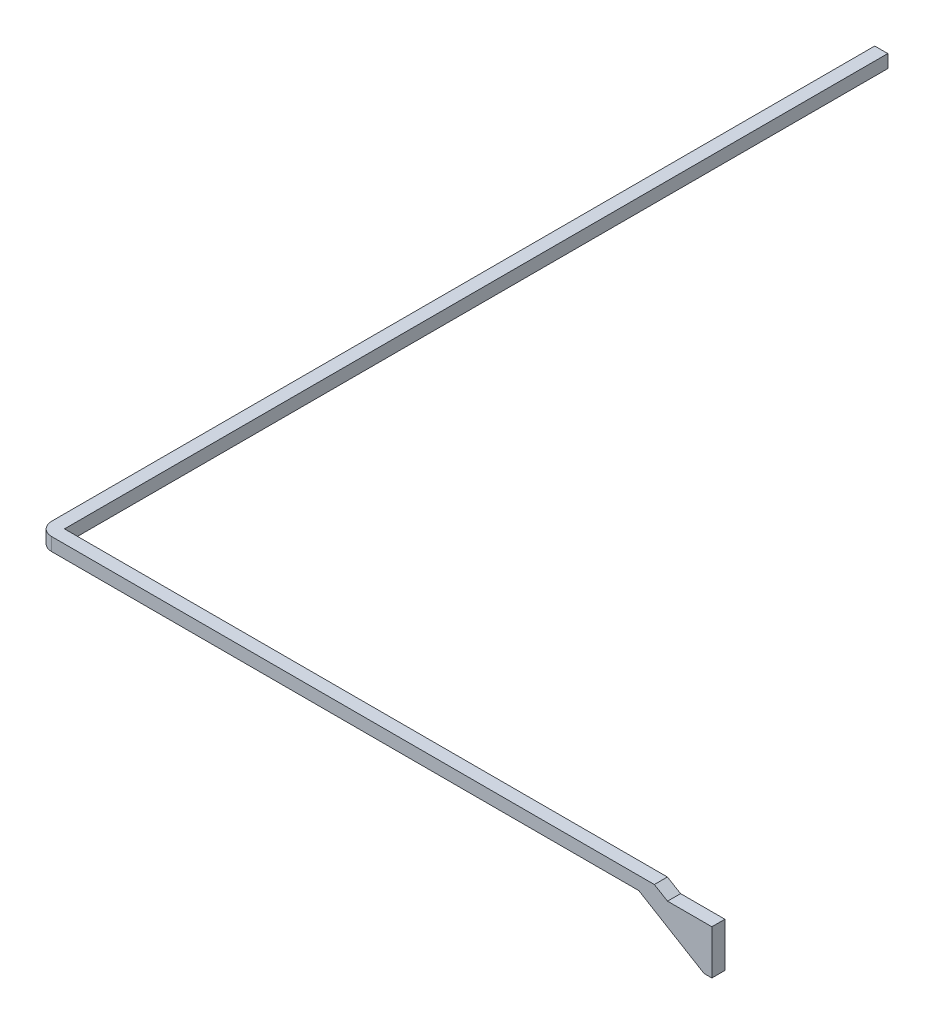
ISO-10303-21;
HEADER;
FILE_DESCRIPTION(('STEP AP214'),'2;1');
FILE_NAME('part.step','',(''),(''),'','','');
FILE_SCHEMA(('AUTOMOTIVE_DESIGN { 1 0 10303 214 1 1 1 1 }'));
ENDSEC;
DATA;
#1=APPLICATION_CONTEXT('core data for automotive mechanical design processes');
#2=APPLICATION_PROTOCOL_DEFINITION('international standard','automotive_design',2000,#1);
#3=PRODUCT_CONTEXT('',#1,'mechanical');
#4=PRODUCT('Part','Part','',(#3));
#5=PRODUCT_RELATED_PRODUCT_CATEGORY('part','',(#4));
#6=PRODUCT_DEFINITION_FORMATION('','',#4);
#7=PRODUCT_DEFINITION_CONTEXT('part definition',#1,'design');
#8=PRODUCT_DEFINITION('design','',#6,#7);
#9=PRODUCT_DEFINITION_SHAPE('','',#8);
#10=(LENGTH_UNIT() NAMED_UNIT(*) SI_UNIT(.MILLI.,.METRE.));
#11=(NAMED_UNIT(*) PLANE_ANGLE_UNIT() SI_UNIT($,.RADIAN.));
#12=(NAMED_UNIT(*) SI_UNIT($,.STERADIAN.) SOLID_ANGLE_UNIT());
#13=UNCERTAINTY_MEASURE_WITH_UNIT(LENGTH_MEASURE(1.E-05),#10,'distance_accuracy_value','');
#14=(GEOMETRIC_REPRESENTATION_CONTEXT(3) GLOBAL_UNCERTAINTY_ASSIGNED_CONTEXT((#13)) GLOBAL_UNIT_ASSIGNED_CONTEXT((#10,
#11,#12)) REPRESENTATION_CONTEXT('',''));
#15=CARTESIAN_POINT('',(0.,0.,0.));
#16=DIRECTION('',(0.,0.,1.));
#17=DIRECTION('',(1.,0.,0.));
#18=AXIS2_PLACEMENT_3D('',#15,#16,#17);
#19=CARTESIAN_POINT('',(0.,-0.25,16.275));
#20=DIRECTION('',(0.,-1.,0.));
#21=DIRECTION('',(0.,0.,-1.));
#22=AXIS2_PLACEMENT_3D('',#19,#20,#21);
#23=PLANE('',#22);
#24=DIRECTION('',(0.,0.,1.));
#25=VECTOR('',#24,1.);
#26=CARTESIAN_POINT('',(0.,-0.25,0.));
#27=LINE('',#26,#25);
#28=CARTESIAN_POINT('',(0.,-0.25,-15.765));
#29=VERTEX_POINT('',#28);
#30=CARTESIAN_POINT('',(0.,-0.25,15.765));
#31=VERTEX_POINT('',#30);
#32=EDGE_CURVE('E199',#29,#31,#27,.T.);
#33=ORIENTED_EDGE('',*,*,#32,.F.);
#34=DIRECTION('',(-1.,0.,0.));
#35=VECTOR('',#34,1.);
#36=CARTESIAN_POINT('',(0.250000000000005,-0.25,-15.765));
#37=LINE('',#36,#35);
#38=CARTESIAN_POINT('',(0.5,-0.25,-15.765));
#39=VERTEX_POINT('',#38);
#40=EDGE_CURVE('E202',#39,#29,#37,.T.);
#41=ORIENTED_EDGE('',*,*,#40,.F.);
#42=DIRECTION('',(0.,0.,-1.));
#43=VECTOR('',#42,1.);
#44=CARTESIAN_POINT('',(0.5,-0.25,0.));
#45=LINE('',#44,#43);
#46=CARTESIAN_POINT('',(0.5,-0.25,15.765));
#47=VERTEX_POINT('',#46);
#48=EDGE_CURVE('E155',#47,#39,#45,.T.);
#49=ORIENTED_EDGE('',*,*,#48,.F.);
#50=CARTESIAN_POINT('',(0.51000000000001,-0.25,15.765));
#51=DIRECTION('',(0.,-1.,0.));
#52=DIRECTION('',(0.,0.,-1.));
#53=AXIS2_PLACEMENT_3D('',#50,#51,#52);
#54=CIRCLE('',#53,0.00999999999999981);
#55=CARTESIAN_POINT('',(0.51000000000001,-0.25,15.775));
#56=VERTEX_POINT('',#55);
#57=EDGE_CURVE('E121',#56,#47,#54,.T.);
#58=ORIENTED_EDGE('',*,*,#57,.F.);
#59=DIRECTION('',(-1.,0.,0.));
#60=VECTOR('',#59,1.);
#61=CARTESIAN_POINT('',(13.155,-0.25,15.775));
#62=LINE('',#61,#60);
#63=CARTESIAN_POINT('',(23.,-0.25,15.775));
#64=VERTEX_POINT('',#63);
#65=EDGE_CURVE('E169',#64,#56,#62,.T.);
#66=ORIENTED_EDGE('',*,*,#65,.F.);
#67=DIRECTION('',(0.,0.,-1.));
#68=VECTOR('',#67,1.);
#69=CARTESIAN_POINT('',(23.,-0.25,16.025));
#70=LINE('',#69,#68);
#71=CARTESIAN_POINT('',(23.,-0.249999999999999,16.275));
#72=VERTEX_POINT('',#71);
#73=EDGE_CURVE('E114',#72,#64,#70,.T.);
#74=ORIENTED_EDGE('',*,*,#73,.F.);
#75=DIRECTION('',(1.,0.,0.));
#76=VECTOR('',#75,1.);
#77=CARTESIAN_POINT('',(13.155,-0.25,16.275));
#78=LINE('',#77,#76);
#79=CARTESIAN_POINT('',(0.51000000000001,-0.25,16.275));
#80=VERTEX_POINT('',#79);
#81=EDGE_CURVE('E145',#80,#72,#78,.T.);
#82=ORIENTED_EDGE('',*,*,#81,.F.);
#83=CARTESIAN_POINT('',(0.51000000000001,-0.25,15.765));
#84=DIRECTION('',(0.,-1.,0.));
#85=DIRECTION('',(0.,0.,-1.));
#86=AXIS2_PLACEMENT_3D('',#83,#84,#85);
#87=CIRCLE('',#86,0.509999999999998);
#88=EDGE_CURVE('E146',#31,#80,#87,.F.);
#89=ORIENTED_EDGE('',*,*,#88,.F.);
#90=EDGE_LOOP('',(#33,#41,#49,#58,#66,#74,#82,#89));
#91=FACE_BOUND('',#90,.T.);
#92=ADVANCED_FACE('F15',(#91),#23,.T.);
#93=CARTESIAN_POINT('',(23.,-0.25,15.775));
#94=DIRECTION('',(-0.514495755427526,-0.857492925712544,0.));
#95=DIRECTION('',(0.857492925712544,-0.514495755427526,0.));
#96=AXIS2_PLACEMENT_3D('',#93,#94,#95);
#97=PLANE('',#96);
#98=DIRECTION('',(-0.857492925712552,0.514495755427514,0.));
#99=VECTOR('',#98,1.);
#100=CARTESIAN_POINT('',(25.5000000000001,-1.75,15.775));
#101=LINE('',#100,#99);
#102=CARTESIAN_POINT('',(25.5,-1.75,15.775));
#103=VERTEX_POINT('',#102);
#104=EDGE_CURVE('E19',#103,#64,#101,.T.);
#105=ORIENTED_EDGE('',*,*,#104,.F.);
#106=DIRECTION('',(0.,0.,-1.));
#107=VECTOR('',#106,1.);
#108=CARTESIAN_POINT('',(25.5,-1.75,16.025));
#109=LINE('',#108,#107);
#110=CARTESIAN_POINT('',(25.5,-1.75,16.275));
#111=VERTEX_POINT('',#110);
#112=EDGE_CURVE('E102',#111,#103,#109,.T.);
#113=ORIENTED_EDGE('',*,*,#112,.F.);
#114=DIRECTION('',(0.857492925712552,-0.514495755427514,0.));
#115=VECTOR('',#114,1.);
#116=CARTESIAN_POINT('',(23.,-0.25,16.275));
#117=LINE('',#116,#115);
#118=EDGE_CURVE('E143',#72,#111,#117,.T.);
#119=ORIENTED_EDGE('',*,*,#118,.F.);
#120=ORIENTED_EDGE('',*,*,#73,.T.);
#121=EDGE_LOOP('',(#105,#113,#119,#120));
#122=FACE_BOUND('',#121,.T.);
#123=ADVANCED_FACE('F118',(#122),#97,.T.);
#124=CARTESIAN_POINT('',(25.5,-1.75,16.275));
#125=DIRECTION('',(0.,-1.,0.));
#126=DIRECTION('',(0.,0.,-1.));
#127=AXIS2_PLACEMENT_3D('',#124,#125,#126);
#128=PLANE('',#127);
#129=DIRECTION('',(-1.,0.,0.));
#130=VECTOR('',#129,1.);
#131=CARTESIAN_POINT('',(13.155,-1.75,15.775));
#132=LINE('',#131,#130);
#133=CARTESIAN_POINT('',(25.8,-1.75,15.775));
#134=VERTEX_POINT('',#133);
#135=EDGE_CURVE('E106',#134,#103,#132,.T.);
#136=ORIENTED_EDGE('',*,*,#135,.F.);
#137=DIRECTION('',(0.,0.,-1.));
#138=VECTOR('',#137,1.);
#139=CARTESIAN_POINT('',(25.8,-1.75,16.025));
#140=LINE('',#139,#138);
#141=CARTESIAN_POINT('',(25.8,-1.75,16.275));
#142=VERTEX_POINT('',#141);
#143=EDGE_CURVE('E113',#142,#134,#140,.T.);
#144=ORIENTED_EDGE('',*,*,#143,.F.);
#145=DIRECTION('',(1.,0.,0.));
#146=VECTOR('',#145,1.);
#147=CARTESIAN_POINT('',(13.155,-1.75,16.275));
#148=LINE('',#147,#146);
#149=EDGE_CURVE('E109',#111,#142,#148,.T.);
#150=ORIENTED_EDGE('',*,*,#149,.F.);
#151=ORIENTED_EDGE('',*,*,#112,.T.);
#152=EDGE_LOOP('',(#136,#144,#150,#151));
#153=FACE_BOUND('',#152,.T.);
#154=ADVANCED_FACE('F104',(#153),#128,.T.);
#155=CARTESIAN_POINT('',(25.8,-1.75,16.275));
#156=DIRECTION('',(1.,0.,0.));
#157=DIRECTION('',(0.,0.,-1.));
#158=AXIS2_PLACEMENT_3D('',#155,#156,#157);
#159=PLANE('',#158);
#160=DIRECTION('',(0.,-1.,0.));
#161=VECTOR('',#160,1.);
#162=CARTESIAN_POINT('',(25.8,-0.75,15.775));
#163=LINE('',#162,#161);
#164=CARTESIAN_POINT('',(25.8,-0.0499999999999999,15.775));
#165=VERTEX_POINT('',#164);
#166=EDGE_CURVE('E125',#165,#134,#163,.T.);
#167=ORIENTED_EDGE('',*,*,#166,.F.);
#168=DIRECTION('',(0.,0.,-1.));
#169=VECTOR('',#168,1.);
#170=CARTESIAN_POINT('',(25.8,-0.05,16.025));
#171=LINE('',#170,#169);
#172=CARTESIAN_POINT('',(25.8,-0.0499999999999999,16.275));
#173=VERTEX_POINT('',#172);
#174=EDGE_CURVE('E182',#173,#165,#171,.T.);
#175=ORIENTED_EDGE('',*,*,#174,.F.);
#176=DIRECTION('',(0.,1.,0.));
#177=VECTOR('',#176,1.);
#178=CARTESIAN_POINT('',(25.8,-0.75,16.275));
#179=LINE('',#178,#177);
#180=EDGE_CURVE('E175',#142,#173,#179,.T.);
#181=ORIENTED_EDGE('',*,*,#180,.F.);
#182=ORIENTED_EDGE('',*,*,#143,.T.);
#183=EDGE_LOOP('',(#167,#175,#181,#182));
#184=FACE_BOUND('',#183,.T.);
#185=ADVANCED_FACE('F354',(#184),#159,.T.);
#186=CARTESIAN_POINT('',(25.8,-0.05,15.775));
#187=DIRECTION('',(0.,1.,0.));
#188=DIRECTION('',(-1.,0.,0.));
#189=AXIS2_PLACEMENT_3D('',#186,#187,#188);
#190=PLANE('',#189);
#191=DIRECTION('',(1.,0.,0.));
#192=VECTOR('',#191,1.);
#193=CARTESIAN_POINT('',(13.155,-0.0499999999999999,15.775));
#194=LINE('',#193,#192);
#195=CARTESIAN_POINT('',(24.1020940546526,-0.05,15.775));
#196=VERTEX_POINT('',#195);
#197=EDGE_CURVE('E127',#196,#165,#194,.T.);
#198=ORIENTED_EDGE('',*,*,#197,.F.);
#199=DIRECTION('',(0.,0.,1.));
#200=VECTOR('',#199,1.);
#201=CARTESIAN_POINT('',(24.1020940546526,-0.05,16.025));
#202=LINE('',#201,#200);
#203=CARTESIAN_POINT('',(24.1020940546526,-0.05,16.275));
#204=VERTEX_POINT('',#203);
#205=EDGE_CURVE('E180',#196,#204,#202,.T.);
#206=ORIENTED_EDGE('',*,*,#205,.T.);
#207=DIRECTION('',(-1.,0.,0.));
#208=VECTOR('',#207,1.);
#209=CARTESIAN_POINT('',(13.155,-0.0499999999999999,16.275));
#210=LINE('',#209,#208);
#211=EDGE_CURVE('E172',#173,#204,#210,.T.);
#212=ORIENTED_EDGE('',*,*,#211,.F.);
#213=ORIENTED_EDGE('',*,*,#174,.T.);
#214=EDGE_LOOP('',(#198,#206,#212,#213));
#215=FACE_BOUND('',#214,.T.);
#216=ADVANCED_FACE('F276',(#215),#190,.T.);
#217=CARTESIAN_POINT('',(25.8,-1.75,15.775));
#218=DIRECTION('',(0.,0.,-1.));
#219=DIRECTION('',(-1.,0.,0.));
#220=AXIS2_PLACEMENT_3D('',#217,#218,#219);
#221=PLANE('',#220);
#222=ORIENTED_EDGE('',*,*,#135,.T.);
#223=ORIENTED_EDGE('',*,*,#104,.T.);
#224=ORIENTED_EDGE('',*,*,#65,.T.);
#225=DIRECTION('',(0.,-1.,0.));
#226=VECTOR('',#225,1.);
#227=CARTESIAN_POINT('',(0.51000000000001,0.,15.775));
#228=LINE('',#227,#226);
#229=CARTESIAN_POINT('',(0.51000000000001,0.25,15.775));
#230=VERTEX_POINT('',#229);
#231=EDGE_CURVE('E151',#230,#56,#228,.T.);
#232=ORIENTED_EDGE('',*,*,#231,.F.);
#233=DIRECTION('',(-1.,0.,0.));
#234=VECTOR('',#233,1.);
#235=CARTESIAN_POINT('',(11.7985325014897,0.25,15.7750000000001));
#236=LINE('',#235,#234);
#237=CARTESIAN_POINT('',(23.5970650029793,0.25,15.775));
#238=VERTEX_POINT('',#237);
#239=EDGE_CURVE('E142',#238,#230,#236,.T.);
#240=ORIENTED_EDGE('',*,*,#239,.F.);
#241=DIRECTION('',(-0.859750847311061,0.510713697239376,0.));
#242=VECTOR('',#241,1.);
#243=CARTESIAN_POINT('',(23.849579528816,0.1,15.775));
#244=LINE('',#243,#242);
#245=EDGE_CURVE('E163',#196,#238,#244,.T.);
#246=ORIENTED_EDGE('',*,*,#245,.F.);
#247=ORIENTED_EDGE('',*,*,#197,.T.);
#248=ORIENTED_EDGE('',*,*,#166,.T.);
#249=EDGE_LOOP('',(#222,#223,#224,#232,#240,#246,#247,#248));
#250=FACE_BOUND('',#249,.T.);
#251=ADVANCED_FACE('F122',(#250),#221,.T.);
#252=CARTESIAN_POINT('',(0.51000000000001,0.3,15.765));
#253=DIRECTION('',(0.,-1.,0.));
#254=DIRECTION('',(0.,0.,-1.));
#255=AXIS2_PLACEMENT_3D('',#252,#253,#254);
#256=CYLINDRICAL_SURFACE('',#255,0.00999999999999981);
#257=CARTESIAN_POINT('',(0.51000000000001,0.25,15.765));
#258=DIRECTION('',(0.,-1.,0.));
#259=DIRECTION('',(0.,0.,-1.));
#260=AXIS2_PLACEMENT_3D('',#257,#258,#259);
#261=CIRCLE('',#260,0.00999999999999981);
#262=CARTESIAN_POINT('',(0.500000000000023,0.25,15.765));
#263=VERTEX_POINT('',#262);
#264=EDGE_CURVE('E138',#230,#263,#261,.T.);
#265=ORIENTED_EDGE('',*,*,#264,.F.);
#266=ORIENTED_EDGE('',*,*,#231,.T.);
#267=ORIENTED_EDGE('',*,*,#57,.T.);
#268=DIRECTION('',(0.,-1.,0.));
#269=VECTOR('',#268,1.);
#270=CARTESIAN_POINT('',(0.5,0.,15.765));
#271=LINE('',#270,#269);
#272=EDGE_CURVE('E158',#263,#47,#271,.T.);
#273=ORIENTED_EDGE('',*,*,#272,.F.);
#274=EDGE_LOOP('',(#265,#266,#267,#273));
#275=FACE_BOUND('',#274,.T.);
#276=ADVANCED_FACE('F267',(#275),#256,.F.);
#277=CARTESIAN_POINT('',(0.5,-0.25,15.765));
#278=DIRECTION('',(1.,0.,0.));
#279=DIRECTION('',(0.,0.,-1.));
#280=AXIS2_PLACEMENT_3D('',#277,#278,#279);
#281=PLANE('',#280);
#282=DIRECTION('',(0.,0.,-1.));
#283=VECTOR('',#282,1.);
#284=CARTESIAN_POINT('',(0.500000000000047,0.25,0.254999999999998));
#285=LINE('',#284,#283);
#286=CARTESIAN_POINT('',(0.500000000000031,0.25,-15.765));
#287=VERTEX_POINT('',#286);
#288=EDGE_CURVE('E141',#263,#287,#285,.T.);
#289=ORIENTED_EDGE('',*,*,#288,.F.);
#290=ORIENTED_EDGE('',*,*,#272,.T.);
#291=ORIENTED_EDGE('',*,*,#48,.T.);
#292=DIRECTION('',(0.,-1.,0.));
#293=VECTOR('',#292,1.);
#294=CARTESIAN_POINT('',(0.5,0.,-15.765));
#295=LINE('',#294,#293);
#296=EDGE_CURVE('E207',#287,#39,#295,.T.);
#297=ORIENTED_EDGE('',*,*,#296,.F.);
#298=EDGE_LOOP('',(#289,#290,#291,#297));
#299=FACE_BOUND('',#298,.T.);
#300=ADVANCED_FACE('F219',(#299),#281,.T.);
#301=CARTESIAN_POINT('',(0.,-0.25,-15.765));
#302=DIRECTION('',(0.,0.,-1.));
#303=DIRECTION('',(0.,1.,0.));
#304=AXIS2_PLACEMENT_3D('',#301,#302,#303);
#305=PLANE('',#304);
#306=ORIENTED_EDGE('',*,*,#296,.T.);
#307=ORIENTED_EDGE('',*,*,#40,.T.);
#308=DIRECTION('',(0.,-1.,0.));
#309=VECTOR('',#308,1.);
#310=CARTESIAN_POINT('',(0.,0.,-15.765));
#311=LINE('',#310,#309);
#312=CARTESIAN_POINT('',(0.,0.25,-15.765));
#313=VERTEX_POINT('',#312);
#314=EDGE_CURVE('E149',#313,#29,#311,.T.);
#315=ORIENTED_EDGE('',*,*,#314,.F.);
#316=DIRECTION('',(-1.,0.,0.));
#317=VECTOR('',#316,1.);
#318=CARTESIAN_POINT('',(11.7985325014897,0.25,-15.765));
#319=LINE('',#318,#317);
#320=EDGE_CURVE('E228',#287,#313,#319,.T.);
#321=ORIENTED_EDGE('',*,*,#320,.F.);
#322=EDGE_LOOP('',(#306,#307,#315,#321));
#323=FACE_BOUND('',#322,.T.);
#324=ADVANCED_FACE('F266',(#323),#305,.T.);
#325=CARTESIAN_POINT('',(0.,-0.25,-15.765));
#326=DIRECTION('',(-1.,0.,0.));
#327=DIRECTION('',(0.,0.,1.));
#328=AXIS2_PLACEMENT_3D('',#325,#326,#327);
#329=PLANE('',#328);
#330=DIRECTION('',(0.,0.,1.));
#331=VECTOR('',#330,1.);
#332=CARTESIAN_POINT('',(0.,0.25,0.254999999999998));
#333=LINE('',#332,#331);
#334=CARTESIAN_POINT('',(0.,0.25,15.765));
#335=VERTEX_POINT('',#334);
#336=EDGE_CURVE('E137',#313,#335,#333,.T.);
#337=ORIENTED_EDGE('',*,*,#336,.F.);
#338=ORIENTED_EDGE('',*,*,#314,.T.);
#339=ORIENTED_EDGE('',*,*,#32,.T.);
#340=DIRECTION('',(0.,-1.,0.));
#341=VECTOR('',#340,1.);
#342=CARTESIAN_POINT('',(0.,0.,15.765));
#343=LINE('',#342,#341);
#344=EDGE_CURVE('E148',#335,#31,#343,.T.);
#345=ORIENTED_EDGE('',*,*,#344,.F.);
#346=EDGE_LOOP('',(#337,#338,#339,#345));
#347=FACE_BOUND('',#346,.T.);
#348=ADVANCED_FACE('F265',(#347),#329,.T.);
#349=CARTESIAN_POINT('',(0.51000000000001,0.3,15.765));
#350=DIRECTION('',(0.,-1.,0.));
#351=DIRECTION('',(0.,0.,-1.));
#352=AXIS2_PLACEMENT_3D('',#349,#350,#351);
#353=CYLINDRICAL_SURFACE('',#352,0.509999999999998);
#354=CARTESIAN_POINT('',(0.51000000000001,0.25,15.765));
#355=DIRECTION('',(0.,-1.,0.));
#356=DIRECTION('',(0.,0.,-1.));
#357=AXIS2_PLACEMENT_3D('',#354,#355,#356);
#358=CIRCLE('',#357,0.509999999999998);
#359=CARTESIAN_POINT('',(0.51000000000001,0.25,16.275));
#360=VERTEX_POINT('',#359);
#361=EDGE_CURVE('E134',#335,#360,#358,.F.);
#362=ORIENTED_EDGE('',*,*,#361,.F.);
#363=ORIENTED_EDGE('',*,*,#344,.T.);
#364=ORIENTED_EDGE('',*,*,#88,.T.);
#365=DIRECTION('',(0.,-1.,0.));
#366=VECTOR('',#365,1.);
#367=CARTESIAN_POINT('',(0.51000000000001,-0.75,16.275));
#368=LINE('',#367,#366);
#369=EDGE_CURVE('E174',#360,#80,#368,.T.);
#370=ORIENTED_EDGE('',*,*,#369,.F.);
#371=EDGE_LOOP('',(#362,#363,#364,#370));
#372=FACE_BOUND('',#371,.T.);
#373=ADVANCED_FACE('F262',(#372),#353,.T.);
#374=CARTESIAN_POINT('',(0.51000000000001,-1.75,16.275));
#375=DIRECTION('',(0.,0.,1.));
#376=DIRECTION('',(1.,0.,0.));
#377=AXIS2_PLACEMENT_3D('',#374,#375,#376);
#378=PLANE('',#377);
#379=DIRECTION('',(1.,0.,0.));
#380=VECTOR('',#379,1.);
#381=CARTESIAN_POINT('',(11.7985325014897,0.25,16.275));
#382=LINE('',#381,#380);
#383=CARTESIAN_POINT('',(23.5970650029793,0.25,16.275));
#384=VERTEX_POINT('',#383);
#385=EDGE_CURVE('E25',#360,#384,#382,.T.);
#386=ORIENTED_EDGE('',*,*,#385,.F.);
#387=ORIENTED_EDGE('',*,*,#369,.T.);
#388=ORIENTED_EDGE('',*,*,#81,.T.);
#389=ORIENTED_EDGE('',*,*,#118,.T.);
#390=ORIENTED_EDGE('',*,*,#149,.T.);
#391=ORIENTED_EDGE('',*,*,#180,.T.);
#392=ORIENTED_EDGE('',*,*,#211,.T.);
#393=DIRECTION('',(0.859750847311061,-0.510713697239376,0.));
#394=VECTOR('',#393,1.);
#395=CARTESIAN_POINT('',(23.849579528816,0.1,16.275));
#396=LINE('',#395,#394);
#397=EDGE_CURVE('E34',#384,#204,#396,.T.);
#398=ORIENTED_EDGE('',*,*,#397,.F.);
#399=EDGE_LOOP('',(#386,#387,#388,#389,#390,#391,#392,#398));
#400=FACE_BOUND('',#399,.T.);
#401=ADVANCED_FACE('F260',(#400),#378,.T.);
#402=CARTESIAN_POINT('',(24.1020940546526,-0.05,15.775));
#403=DIRECTION('',(0.510713697239376,0.859750847311061,0.));
#404=DIRECTION('',(-0.859750847311061,0.510713697239376,0.));
#405=AXIS2_PLACEMENT_3D('',#402,#403,#404);
#406=PLANE('',#405);
#407=ORIENTED_EDGE('',*,*,#245,.T.);
#408=DIRECTION('',(0.,0.,-1.));
#409=VECTOR('',#408,1.);
#410=CARTESIAN_POINT('',(23.5970650029793,0.25,0.254999999999998));
#411=LINE('',#410,#409);
#412=EDGE_CURVE('E10',#384,#238,#411,.T.);
#413=ORIENTED_EDGE('',*,*,#412,.F.);
#414=ORIENTED_EDGE('',*,*,#397,.T.);
#415=ORIENTED_EDGE('',*,*,#205,.F.);
#416=EDGE_LOOP('',(#407,#413,#414,#415));
#417=FACE_BOUND('',#416,.T.);
#418=ADVANCED_FACE('F279',(#417),#406,.T.);
#419=CARTESIAN_POINT('',(0.,0.25,16.275));
#420=DIRECTION('',(0.,1.,0.));
#421=DIRECTION('',(1.,0.,0.));
#422=AXIS2_PLACEMENT_3D('',#419,#420,#421);
#423=PLANE('',#422);
#424=ORIENTED_EDGE('',*,*,#385,.T.);
#425=ORIENTED_EDGE('',*,*,#412,.T.);
#426=ORIENTED_EDGE('',*,*,#239,.T.);
#427=ORIENTED_EDGE('',*,*,#264,.T.);
#428=ORIENTED_EDGE('',*,*,#288,.T.);
#429=ORIENTED_EDGE('',*,*,#320,.T.);
#430=ORIENTED_EDGE('',*,*,#336,.T.);
#431=ORIENTED_EDGE('',*,*,#361,.T.);
#432=EDGE_LOOP('',(#424,#425,#426,#427,#428,#429,#430,#431));
#433=FACE_BOUND('',#432,.T.);
#434=ADVANCED_FACE('F17',(#433),#423,.T.);
#435=CLOSED_SHELL('',(#92,#123,#154,#185,#216,#251,#276,#300,#324,#348,#373,#401,#418,#434));
#436=MANIFOLD_SOLID_BREP('B1',#435);
#437=ADVANCED_BREP_SHAPE_REPRESENTATION('',(#18,#436),#14);
#438=SHAPE_DEFINITION_REPRESENTATION(#9,#437);
ENDSEC;
END-ISO-10303-21;
